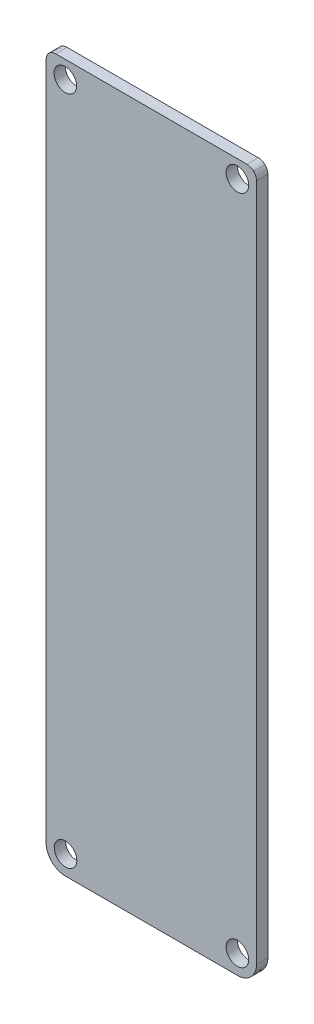
ISO-10303-21;
HEADER;
FILE_DESCRIPTION(('STEP AP214'),'2;1');
FILE_NAME('part.step','',(''),(''),'','','');
FILE_SCHEMA(('AUTOMOTIVE_DESIGN { 1 0 10303 214 1 1 1 1 }'));
ENDSEC;
DATA;
#1=APPLICATION_CONTEXT('core data for automotive mechanical design processes');
#2=APPLICATION_PROTOCOL_DEFINITION('international standard','automotive_design',2000,#1);
#3=PRODUCT_CONTEXT('',#1,'mechanical');
#4=PRODUCT('Part','Part','',(#3));
#5=PRODUCT_RELATED_PRODUCT_CATEGORY('part','',(#4));
#6=PRODUCT_DEFINITION_FORMATION('','',#4);
#7=PRODUCT_DEFINITION_CONTEXT('part definition',#1,'design');
#8=PRODUCT_DEFINITION('design','',#6,#7);
#9=PRODUCT_DEFINITION_SHAPE('','',#8);
#10=(LENGTH_UNIT() NAMED_UNIT(*) SI_UNIT(.MILLI.,.METRE.));
#11=(NAMED_UNIT(*) PLANE_ANGLE_UNIT() SI_UNIT($,.RADIAN.));
#12=(NAMED_UNIT(*) SI_UNIT($,.STERADIAN.) SOLID_ANGLE_UNIT());
#13=UNCERTAINTY_MEASURE_WITH_UNIT(LENGTH_MEASURE(1.E-05),#10,'distance_accuracy_value','');
#14=(GEOMETRIC_REPRESENTATION_CONTEXT(3) GLOBAL_UNCERTAINTY_ASSIGNED_CONTEXT((#13)) GLOBAL_UNIT_ASSIGNED_CONTEXT((#10,
#11,#12)) REPRESENTATION_CONTEXT('',''));
#15=CARTESIAN_POINT('',(0.,0.,0.));
#16=DIRECTION('',(0.,0.,1.));
#17=DIRECTION('',(1.,0.,0.));
#18=AXIS2_PLACEMENT_3D('',#15,#16,#17);
#19=CARTESIAN_POINT('',(110.49,-33.623931,1.5));
#20=CARTESIAN_POINT('',(110.49,-33.287106,1.5));
#21=CARTESIAN_POINT('',(110.356197,-32.964076,1.5));
#22=CARTESIAN_POINT('',(110.118026,-32.725905,1.5));
#23=B_SPLINE_CURVE_WITH_KNOTS('',3,(#19,#20,#21,#22),.UNSPECIFIED.,.F.,.F.,(4,4),(0.,1.),.UNSPECIFIED.);
#24=DIRECTION('',(0.,0.,-1.));
#25=VECTOR('',#24,1.);
#26=SURFACE_OF_LINEAR_EXTRUSION('',#23,#25);
#27=CARTESIAN_POINT('',(110.49,-33.623931,0.));
#28=CARTESIAN_POINT('',(110.49,-33.287106,0.));
#29=CARTESIAN_POINT('',(110.356197,-32.964076,0.));
#30=CARTESIAN_POINT('',(110.118026,-32.725905,0.));
#31=B_SPLINE_CURVE_WITH_KNOTS('',3,(#27,#28,#29,#30),.UNSPECIFIED.,.F.,.F.,(4,4),(0.,1.),.UNSPECIFIED.);
#32=CARTESIAN_POINT('',(110.49,-33.623931,0.));
#33=VERTEX_POINT('',#32);
#34=CARTESIAN_POINT('',(110.118026,-32.725905,0.));
#35=VERTEX_POINT('',#34);
#36=EDGE_CURVE('E293',#33,#35,#31,.T.);
#37=ORIENTED_EDGE('',*,*,#36,.T.);
#38=DIRECTION('',(0.,0.,-1.));
#39=VECTOR('',#38,1.);
#40=CARTESIAN_POINT('',(110.118026,-32.725905,1.5));
#41=LINE('',#40,#39);
#42=CARTESIAN_POINT('',(110.118026,-32.725905,1.5));
#43=VERTEX_POINT('',#42);
#44=EDGE_CURVE('E11',#43,#35,#41,.T.);
#45=ORIENTED_EDGE('',*,*,#44,.F.);
#46=CARTESIAN_POINT('',(110.49,-33.623931,1.5));
#47=VERTEX_POINT('',#46);
#48=EDGE_CURVE('E233',#47,#43,#23,.T.);
#49=ORIENTED_EDGE('',*,*,#48,.F.);
#50=DIRECTION('',(0.,0.,-1.));
#51=VECTOR('',#50,1.);
#52=CARTESIAN_POINT('',(110.49,-33.623931,1.5));
#53=LINE('',#52,#51);
#54=EDGE_CURVE('E150',#47,#33,#53,.T.);
#55=ORIENTED_EDGE('',*,*,#54,.T.);
#56=EDGE_LOOP('',(#37,#45,#49,#55));
#57=FACE_BOUND('',#56,.T.);
#58=ADVANCED_FACE('F32',(#57),#26,.F.);
#59=CARTESIAN_POINT('',(110.118026,-32.725905,1.5));
#60=CARTESIAN_POINT('',(109.879854,-32.487734,1.5));
#61=CARTESIAN_POINT('',(109.556825,-32.353931,1.5));
#62=CARTESIAN_POINT('',(109.22,-32.353931,1.5));
#63=B_SPLINE_CURVE_WITH_KNOTS('',3,(#59,#60,#61,#62),.UNSPECIFIED.,.F.,.F.,(4,4),(0.,1.),.UNSPECIFIED.);
#64=DIRECTION('',(0.,0.,-1.));
#65=VECTOR('',#64,1.);
#66=SURFACE_OF_LINEAR_EXTRUSION('',#63,#65);
#67=CARTESIAN_POINT('',(110.118026,-32.725905,0.));
#68=CARTESIAN_POINT('',(109.879854,-32.487734,0.));
#69=CARTESIAN_POINT('',(109.556825,-32.353931,0.));
#70=CARTESIAN_POINT('',(109.22,-32.353931,0.));
#71=B_SPLINE_CURVE_WITH_KNOTS('',3,(#67,#68,#69,#70),.UNSPECIFIED.,.F.,.F.,(4,4),(0.,1.),.UNSPECIFIED.);
#72=CARTESIAN_POINT('',(109.22,-32.353931,0.));
#73=VERTEX_POINT('',#72);
#74=EDGE_CURVE('E290',#35,#73,#71,.T.);
#75=ORIENTED_EDGE('',*,*,#74,.T.);
#76=DIRECTION('',(0.,0.,-1.));
#77=VECTOR('',#76,1.);
#78=CARTESIAN_POINT('',(109.22,-32.353931,1.5));
#79=LINE('',#78,#77);
#80=CARTESIAN_POINT('',(109.22,-32.353931,1.5));
#81=VERTEX_POINT('',#80);
#82=EDGE_CURVE('E41',#81,#73,#79,.T.);
#83=ORIENTED_EDGE('',*,*,#82,.F.);
#84=EDGE_CURVE('E102',#43,#81,#63,.T.);
#85=ORIENTED_EDGE('',*,*,#84,.F.);
#86=ORIENTED_EDGE('',*,*,#44,.T.);
#87=EDGE_LOOP('',(#75,#83,#85,#86));
#88=FACE_BOUND('',#87,.T.);
#89=ADVANCED_FACE('F225',(#88),#66,.F.);
#90=CARTESIAN_POINT('',(83.82,-32.353931,1.5));
#91=DIRECTION('',(0.,-1.,0.));
#92=DIRECTION('',(0.,0.,-1.));
#93=AXIS2_PLACEMENT_3D('',#90,#91,#92);
#94=PLANE('',#93);
#95=DIRECTION('',(-1.,0.,0.));
#96=VECTOR('',#95,1.);
#97=CARTESIAN_POINT('',(83.82,-32.353931,0.));
#98=LINE('',#97,#96);
#99=CARTESIAN_POINT('',(83.82,-32.353931,0.));
#100=VERTEX_POINT('',#99);
#101=EDGE_CURVE('E288',#73,#100,#98,.T.);
#102=ORIENTED_EDGE('',*,*,#101,.T.);
#103=DIRECTION('',(0.,0.,-1.));
#104=VECTOR('',#103,1.);
#105=CARTESIAN_POINT('',(83.82,-32.353931,1.5));
#106=LINE('',#105,#104);
#107=CARTESIAN_POINT('',(83.82,-32.353931,1.5));
#108=VERTEX_POINT('',#107);
#109=EDGE_CURVE('E254',#108,#100,#106,.T.);
#110=ORIENTED_EDGE('',*,*,#109,.F.);
#111=DIRECTION('',(-1.,0.,0.));
#112=VECTOR('',#111,1.);
#113=CARTESIAN_POINT('',(83.82,-32.353931,1.5));
#114=LINE('',#113,#112);
#115=EDGE_CURVE('E232',#81,#108,#114,.T.);
#116=ORIENTED_EDGE('',*,*,#115,.F.);
#117=ORIENTED_EDGE('',*,*,#82,.T.);
#118=EDGE_LOOP('',(#102,#110,#116,#117));
#119=FACE_BOUND('',#118,.T.);
#120=ADVANCED_FACE('F222',(#119),#94,.F.);
#121=CARTESIAN_POINT('',(83.82,-32.353931,1.5));
#122=CARTESIAN_POINT('',(83.483175,-32.353931,1.5));
#123=CARTESIAN_POINT('',(83.160146,-32.487734,1.5));
#124=CARTESIAN_POINT('',(82.921974,-32.725905,1.5));
#125=B_SPLINE_CURVE_WITH_KNOTS('',3,(#121,#122,#123,#124),.UNSPECIFIED.,.F.,.F.,(4,4),(0.,1.),.UNSPECIFIED.);
#126=DIRECTION('',(0.,0.,-1.));
#127=VECTOR('',#126,1.);
#128=SURFACE_OF_LINEAR_EXTRUSION('',#125,#127);
#129=CARTESIAN_POINT('',(83.82,-32.353931,0.));
#130=CARTESIAN_POINT('',(83.483175,-32.353931,0.));
#131=CARTESIAN_POINT('',(83.160146,-32.487734,0.));
#132=CARTESIAN_POINT('',(82.921974,-32.725905,0.));
#133=B_SPLINE_CURVE_WITH_KNOTS('',3,(#129,#130,#131,#132),.UNSPECIFIED.,.F.,.F.,(4,4),(0.,1.),.UNSPECIFIED.);
#134=CARTESIAN_POINT('',(82.921974,-32.725905,0.));
#135=VERTEX_POINT('',#134);
#136=EDGE_CURVE('E251',#100,#135,#133,.T.);
#137=ORIENTED_EDGE('',*,*,#136,.T.);
#138=DIRECTION('',(0.,0.,-1.));
#139=VECTOR('',#138,1.);
#140=CARTESIAN_POINT('',(82.921974,-32.725905,1.5));
#141=LINE('',#140,#139);
#142=CARTESIAN_POINT('',(82.921974,-32.725905,1.5));
#143=VERTEX_POINT('',#142);
#144=EDGE_CURVE('E249',#143,#135,#141,.T.);
#145=ORIENTED_EDGE('',*,*,#144,.F.);
#146=EDGE_CURVE('E205',#108,#143,#125,.T.);
#147=ORIENTED_EDGE('',*,*,#146,.F.);
#148=ORIENTED_EDGE('',*,*,#109,.T.);
#149=EDGE_LOOP('',(#137,#145,#147,#148));
#150=FACE_BOUND('',#149,.T.);
#151=ADVANCED_FACE('F218',(#150),#128,.F.);
#152=CARTESIAN_POINT('',(82.921974,-32.725905,1.5));
#153=CARTESIAN_POINT('',(82.683803,-32.964076,1.5));
#154=CARTESIAN_POINT('',(82.55,-33.287106,1.5));
#155=CARTESIAN_POINT('',(82.55,-33.623931,1.5));
#156=B_SPLINE_CURVE_WITH_KNOTS('',3,(#152,#153,#154,#155),.UNSPECIFIED.,.F.,.F.,(4,4),(0.,1.),.UNSPECIFIED.);
#157=DIRECTION('',(0.,0.,-1.));
#158=VECTOR('',#157,1.);
#159=SURFACE_OF_LINEAR_EXTRUSION('',#156,#158);
#160=CARTESIAN_POINT('',(82.921974,-32.725905,0.));
#161=CARTESIAN_POINT('',(82.683803,-32.964076,0.));
#162=CARTESIAN_POINT('',(82.55,-33.287106,0.));
#163=CARTESIAN_POINT('',(82.55,-33.623931,0.));
#164=B_SPLINE_CURVE_WITH_KNOTS('',3,(#160,#161,#162,#163),.UNSPECIFIED.,.F.,.F.,(4,4),(0.,1.),.UNSPECIFIED.);
#165=CARTESIAN_POINT('',(82.55,-33.623931,0.));
#166=VERTEX_POINT('',#165);
#167=EDGE_CURVE('E259',#135,#166,#164,.T.);
#168=ORIENTED_EDGE('',*,*,#167,.T.);
#169=DIRECTION('',(0.,0.,-1.));
#170=VECTOR('',#169,1.);
#171=CARTESIAN_POINT('',(82.55,-33.623931,1.5));
#172=LINE('',#171,#170);
#173=CARTESIAN_POINT('',(82.55,-33.623931,1.5));
#174=VERTEX_POINT('',#173);
#175=EDGE_CURVE('E255',#174,#166,#172,.T.);
#176=ORIENTED_EDGE('',*,*,#175,.F.);
#177=EDGE_CURVE('E200',#143,#174,#156,.T.);
#178=ORIENTED_EDGE('',*,*,#177,.F.);
#179=ORIENTED_EDGE('',*,*,#144,.T.);
#180=EDGE_LOOP('',(#168,#176,#178,#179));
#181=FACE_BOUND('',#180,.T.);
#182=ADVANCED_FACE('F214',(#181),#159,.F.);
#183=CARTESIAN_POINT('',(82.55,-39.893931,1.5));
#184=DIRECTION('',(1.,0.,0.));
#185=DIRECTION('',(0.,0.,-1.));
#186=AXIS2_PLACEMENT_3D('',#183,#184,#185);
#187=PLANE('',#186);
#188=DIRECTION('',(0.,-1.,0.));
#189=VECTOR('',#188,1.);
#190=CARTESIAN_POINT('',(82.55,-39.893931,0.));
#191=LINE('',#190,#189);
#192=CARTESIAN_POINT('',(82.55,-123.713931,0.));
#193=VERTEX_POINT('',#192);
#194=EDGE_CURVE('E306',#166,#193,#191,.T.);
#195=ORIENTED_EDGE('',*,*,#194,.T.);
#196=DIRECTION('',(0.,0.,-1.));
#197=VECTOR('',#196,1.);
#198=CARTESIAN_POINT('',(82.55,-123.713931,1.5));
#199=LINE('',#198,#197);
#200=CARTESIAN_POINT('',(82.55,-123.713931,1.5));
#201=VERTEX_POINT('',#200);
#202=EDGE_CURVE('E261',#201,#193,#199,.T.);
#203=ORIENTED_EDGE('',*,*,#202,.F.);
#204=DIRECTION('',(0.,-1.,0.));
#205=VECTOR('',#204,1.);
#206=CARTESIAN_POINT('',(82.55,-38.623931,1.5));
#207=LINE('',#206,#205);
#208=EDGE_CURVE('E195',#174,#201,#207,.T.);
#209=ORIENTED_EDGE('',*,*,#208,.F.);
#210=ORIENTED_EDGE('',*,*,#175,.T.);
#211=EDGE_LOOP('',(#195,#203,#209,#210));
#212=FACE_BOUND('',#211,.T.);
#213=ADVANCED_FACE('F217',(#212),#187,.F.);
#214=CARTESIAN_POINT('',(82.55,-123.713931,1.5));
#215=CARTESIAN_POINT('',(82.55,-124.387581,1.5));
#216=CARTESIAN_POINT('',(82.817606,-125.03364,1.5));
#217=CARTESIAN_POINT('',(83.293949,-125.509982,1.5));
#218=B_SPLINE_CURVE_WITH_KNOTS('',3,(#214,#215,#216,#217),.UNSPECIFIED.,.F.,.F.,(4,4),(0.,1.),.UNSPECIFIED.);
#219=DIRECTION('',(0.,0.,-1.));
#220=VECTOR('',#219,1.);
#221=SURFACE_OF_LINEAR_EXTRUSION('',#218,#220);
#222=CARTESIAN_POINT('',(82.55,-123.713931,0.));
#223=CARTESIAN_POINT('',(82.55,-124.387581,0.));
#224=CARTESIAN_POINT('',(82.817606,-125.03364,0.));
#225=CARTESIAN_POINT('',(83.293949,-125.509982,0.));
#226=B_SPLINE_CURVE_WITH_KNOTS('',3,(#222,#223,#224,#225),.UNSPECIFIED.,.F.,.F.,(4,4),(0.,1.),.UNSPECIFIED.);
#227=CARTESIAN_POINT('',(83.293949,-125.509982,0.));
#228=VERTEX_POINT('',#227);
#229=EDGE_CURVE('E273',#193,#228,#226,.T.);
#230=ORIENTED_EDGE('',*,*,#229,.T.);
#231=DIRECTION('',(0.,0.,-1.));
#232=VECTOR('',#231,1.);
#233=CARTESIAN_POINT('',(83.293949,-125.509982,1.5));
#234=LINE('',#233,#232);
#235=CARTESIAN_POINT('',(83.293949,-125.509982,1.5));
#236=VERTEX_POINT('',#235);
#237=EDGE_CURVE('E271',#236,#228,#234,.T.);
#238=ORIENTED_EDGE('',*,*,#237,.F.);
#239=EDGE_CURVE('E187',#201,#236,#218,.T.);
#240=ORIENTED_EDGE('',*,*,#239,.F.);
#241=ORIENTED_EDGE('',*,*,#202,.T.);
#242=EDGE_LOOP('',(#230,#238,#240,#241));
#243=FACE_BOUND('',#242,.T.);
#244=ADVANCED_FACE('F179',(#243),#221,.F.);
#245=CARTESIAN_POINT('',(83.293949,-125.509982,1.5));
#246=CARTESIAN_POINT('',(83.770291,-125.986325,1.5));
#247=CARTESIAN_POINT('',(84.41635,-126.253931,1.5));
#248=CARTESIAN_POINT('',(85.09,-126.253931,1.5));
#249=B_SPLINE_CURVE_WITH_KNOTS('',3,(#245,#246,#247,#248),.UNSPECIFIED.,.F.,.F.,(4,4),(0.,1.),.UNSPECIFIED.);
#250=DIRECTION('',(0.,0.,-1.));
#251=VECTOR('',#250,1.);
#252=SURFACE_OF_LINEAR_EXTRUSION('',#249,#251);
#253=CARTESIAN_POINT('',(83.293949,-125.509982,0.));
#254=CARTESIAN_POINT('',(83.770291,-125.986325,0.));
#255=CARTESIAN_POINT('',(84.41635,-126.253931,0.));
#256=CARTESIAN_POINT('',(85.09,-126.253931,0.));
#257=B_SPLINE_CURVE_WITH_KNOTS('',3,(#253,#254,#255,#256),.UNSPECIFIED.,.F.,.F.,(4,4),(0.,1.),.UNSPECIFIED.);
#258=CARTESIAN_POINT('',(85.09,-126.253931,0.));
#259=VERTEX_POINT('',#258);
#260=EDGE_CURVE('E278',#228,#259,#257,.T.);
#261=ORIENTED_EDGE('',*,*,#260,.T.);
#262=DIRECTION('',(0.,0.,-1.));
#263=VECTOR('',#262,1.);
#264=CARTESIAN_POINT('',(85.09,-126.253931,1.5));
#265=LINE('',#264,#263);
#266=CARTESIAN_POINT('',(85.09,-126.253931,1.5));
#267=VERTEX_POINT('',#266);
#268=EDGE_CURVE('E275',#267,#259,#265,.T.);
#269=ORIENTED_EDGE('',*,*,#268,.F.);
#270=EDGE_CURVE('E183',#236,#267,#249,.T.);
#271=ORIENTED_EDGE('',*,*,#270,.F.);
#272=ORIENTED_EDGE('',*,*,#237,.T.);
#273=EDGE_LOOP('',(#261,#269,#271,#272));
#274=FACE_BOUND('',#273,.T.);
#275=ADVANCED_FACE('F174',(#274),#252,.F.);
#276=CARTESIAN_POINT('',(85.09,-126.253931,1.5));
#277=DIRECTION('',(0.,1.,0.));
#278=DIRECTION('',(0.,0.,1.));
#279=AXIS2_PLACEMENT_3D('',#276,#277,#278);
#280=PLANE('',#279);
#281=DIRECTION('',(1.,0.,0.));
#282=VECTOR('',#281,1.);
#283=CARTESIAN_POINT('',(85.09,-126.253931,0.));
#284=LINE('',#283,#282);
#285=CARTESIAN_POINT('',(107.95,-126.253931,0.));
#286=VERTEX_POINT('',#285);
#287=EDGE_CURVE('E281',#259,#286,#284,.T.);
#288=ORIENTED_EDGE('',*,*,#287,.T.);
#289=DIRECTION('',(0.,0.,-1.));
#290=VECTOR('',#289,1.);
#291=CARTESIAN_POINT('',(107.95,-126.253931,1.5));
#292=LINE('',#291,#290);
#293=CARTESIAN_POINT('',(107.95,-126.253931,1.5));
#294=VERTEX_POINT('',#293);
#295=EDGE_CURVE('E145',#294,#286,#292,.T.);
#296=ORIENTED_EDGE('',*,*,#295,.F.);
#297=DIRECTION('',(1.,0.,0.));
#298=VECTOR('',#297,1.);
#299=CARTESIAN_POINT('',(85.09,-126.253931,1.5));
#300=LINE('',#299,#298);
#301=EDGE_CURVE('E134',#267,#294,#300,.T.);
#302=ORIENTED_EDGE('',*,*,#301,.F.);
#303=ORIENTED_EDGE('',*,*,#268,.T.);
#304=EDGE_LOOP('',(#288,#296,#302,#303));
#305=FACE_BOUND('',#304,.T.);
#306=ADVANCED_FACE('F171',(#305),#280,.F.);
#307=CARTESIAN_POINT('',(107.95,-126.253931,1.5));
#308=CARTESIAN_POINT('',(108.62365,-126.253931,1.5));
#309=CARTESIAN_POINT('',(109.269709,-125.986325,1.5));
#310=CARTESIAN_POINT('',(109.746051,-125.509982,1.5));
#311=B_SPLINE_CURVE_WITH_KNOTS('',3,(#307,#308,#309,#310),.UNSPECIFIED.,.F.,.F.,(4,4),(0.,1.),.UNSPECIFIED.);
#312=DIRECTION('',(0.,0.,-1.));
#313=VECTOR('',#312,1.);
#314=SURFACE_OF_LINEAR_EXTRUSION('',#311,#313);
#315=CARTESIAN_POINT('',(107.95,-126.253931,0.));
#316=CARTESIAN_POINT('',(108.62365,-126.253931,0.));
#317=CARTESIAN_POINT('',(109.269709,-125.986325,0.));
#318=CARTESIAN_POINT('',(109.746051,-125.509982,0.));
#319=B_SPLINE_CURVE_WITH_KNOTS('',3,(#315,#316,#317,#318),.UNSPECIFIED.,.F.,.F.,(4,4),(0.,1.),.UNSPECIFIED.);
#320=CARTESIAN_POINT('',(109.746051,-125.509982,0.));
#321=VERTEX_POINT('',#320);
#322=EDGE_CURVE('E143',#286,#321,#319,.T.);
#323=ORIENTED_EDGE('',*,*,#322,.T.);
#324=DIRECTION('',(0.,0.,-1.));
#325=VECTOR('',#324,1.);
#326=CARTESIAN_POINT('',(109.746051,-125.509982,1.5));
#327=LINE('',#326,#325);
#328=CARTESIAN_POINT('',(109.746051,-125.509982,1.5));
#329=VERTEX_POINT('',#328);
#330=EDGE_CURVE('E140',#329,#321,#327,.T.);
#331=ORIENTED_EDGE('',*,*,#330,.F.);
#332=EDGE_CURVE('E127',#294,#329,#311,.T.);
#333=ORIENTED_EDGE('',*,*,#332,.F.);
#334=ORIENTED_EDGE('',*,*,#295,.T.);
#335=EDGE_LOOP('',(#323,#331,#333,#334));
#336=FACE_BOUND('',#335,.T.);
#337=ADVANCED_FACE('F141',(#336),#314,.F.);
#338=CARTESIAN_POINT('',(109.746051,-125.509982,1.5));
#339=CARTESIAN_POINT('',(110.222394,-125.03364,1.5));
#340=CARTESIAN_POINT('',(110.49,-124.387581,1.5));
#341=CARTESIAN_POINT('',(110.49,-123.713931,1.5));
#342=B_SPLINE_CURVE_WITH_KNOTS('',3,(#338,#339,#340,#341),.UNSPECIFIED.,.F.,.F.,(4,4),(0.,1.),.UNSPECIFIED.);
#343=DIRECTION('',(0.,0.,-1.));
#344=VECTOR('',#343,1.);
#345=SURFACE_OF_LINEAR_EXTRUSION('',#342,#344);
#346=CARTESIAN_POINT('',(109.746051,-125.509982,0.));
#347=CARTESIAN_POINT('',(110.222394,-125.03364,0.));
#348=CARTESIAN_POINT('',(110.49,-124.387581,0.));
#349=CARTESIAN_POINT('',(110.49,-123.713931,0.));
#350=B_SPLINE_CURVE_WITH_KNOTS('',3,(#346,#347,#348,#349),.UNSPECIFIED.,.F.,.F.,(4,4),(0.,1.),.UNSPECIFIED.);
#351=CARTESIAN_POINT('',(110.49,-123.713931,0.));
#352=VERTEX_POINT('',#351);
#353=EDGE_CURVE('E327',#321,#352,#350,.T.);
#354=ORIENTED_EDGE('',*,*,#353,.T.);
#355=DIRECTION('',(0.,0.,-1.));
#356=VECTOR('',#355,1.);
#357=CARTESIAN_POINT('',(110.49,-123.713931,1.5));
#358=LINE('',#357,#356);
#359=CARTESIAN_POINT('',(110.49,-123.713931,1.5));
#360=VERTEX_POINT('',#359);
#361=EDGE_CURVE('E146',#360,#352,#358,.T.);
#362=ORIENTED_EDGE('',*,*,#361,.F.);
#363=EDGE_CURVE('E131',#329,#360,#342,.T.);
#364=ORIENTED_EDGE('',*,*,#363,.F.);
#365=ORIENTED_EDGE('',*,*,#330,.T.);
#366=EDGE_LOOP('',(#354,#362,#364,#365));
#367=FACE_BOUND('',#366,.T.);
#368=ADVANCED_FACE('F148',(#367),#345,.F.);
#369=CARTESIAN_POINT('',(110.49,-33.623931,1.5));
#370=DIRECTION('',(-1.,0.,0.));
#371=DIRECTION('',(0.,0.,1.));
#372=AXIS2_PLACEMENT_3D('',#369,#370,#371);
#373=PLANE('',#372);
#374=DIRECTION('',(0.,1.,0.));
#375=VECTOR('',#374,1.);
#376=CARTESIAN_POINT('',(110.49,-33.623931,0.));
#377=LINE('',#376,#375);
#378=EDGE_CURVE('E90',#352,#33,#377,.T.);
#379=ORIENTED_EDGE('',*,*,#378,.T.);
#380=ORIENTED_EDGE('',*,*,#54,.F.);
#381=DIRECTION('',(0.,1.,0.));
#382=VECTOR('',#381,1.);
#383=CARTESIAN_POINT('',(110.49,-39.893931,1.5));
#384=LINE('',#383,#382);
#385=EDGE_CURVE('E49',#360,#47,#384,.T.);
#386=ORIENTED_EDGE('',*,*,#385,.F.);
#387=ORIENTED_EDGE('',*,*,#361,.T.);
#388=EDGE_LOOP('',(#379,#380,#386,#387));
#389=FACE_BOUND('',#388,.T.);
#390=ADVANCED_FACE('F167',(#389),#373,.F.);
#391=CARTESIAN_POINT('',(110.393327125,-33.13792275,1.5));
#392=DIRECTION('',(0.,0.,-1.));
#393=DIRECTION('',(-1.,0.,0.));
#394=AXIS2_PLACEMENT_3D('',#391,#392,#393);
#395=PLANE('',#394);
#396=CARTESIAN_POINT('',(107.943434753132,-123.713931,1.5));
#397=DIRECTION('',(0.,0.,-1.));
#398=DIRECTION('',(-1.,0.,0.));
#399=AXIS2_PLACEMENT_3D('',#396,#397,#398);
#400=CIRCLE('',#399,1.5);
#401=CARTESIAN_POINT('',(106.443434753132,-123.713931,1.5));
#402=VERTEX_POINT('',#401);
#403=EDGE_CURVE('E342',#402,#402,#400,.T.);
#404=ORIENTED_EDGE('',*,*,#403,.T.);
#405=EDGE_LOOP('',(#404));
#406=FACE_BOUND('',#405,.T.);
#407=CARTESIAN_POINT('',(85.1247717146963,-123.713931,1.5));
#408=DIRECTION('',(0.,0.,-1.));
#409=DIRECTION('',(-1.,0.,0.));
#410=AXIS2_PLACEMENT_3D('',#407,#408,#409);
#411=CIRCLE('',#410,1.5);
#412=CARTESIAN_POINT('',(83.6247717146963,-123.713931,1.5));
#413=VERTEX_POINT('',#412);
#414=EDGE_CURVE('E344',#413,#413,#411,.T.);
#415=ORIENTED_EDGE('',*,*,#414,.T.);
#416=EDGE_LOOP('',(#415));
#417=FACE_BOUND('',#416,.T.);
#418=CARTESIAN_POINT('',(85.0965652468675,-34.6757095580392,1.5));
#419=DIRECTION('',(0.,0.,-1.));
#420=DIRECTION('',(-1.,0.,0.));
#421=AXIS2_PLACEMENT_3D('',#418,#419,#420);
#422=CIRCLE('',#421,1.5);
#423=CARTESIAN_POINT('',(83.5965652468675,-34.6757095580392,1.5));
#424=VERTEX_POINT('',#423);
#425=EDGE_CURVE('E353',#424,#424,#422,.T.);
#426=ORIENTED_EDGE('',*,*,#425,.T.);
#427=EDGE_LOOP('',(#426));
#428=FACE_BOUND('',#427,.T.);
#429=CARTESIAN_POINT('',(107.943434753132,-34.6757095580392,1.5));
#430=DIRECTION('',(0.,0.,-1.));
#431=DIRECTION('',(-1.,0.,0.));
#432=AXIS2_PLACEMENT_3D('',#429,#430,#431);
#433=CIRCLE('',#432,1.5);
#434=CARTESIAN_POINT('',(106.443434753132,-34.6757095580392,1.5));
#435=VERTEX_POINT('',#434);
#436=EDGE_CURVE('E358',#435,#435,#433,.T.);
#437=ORIENTED_EDGE('',*,*,#436,.T.);
#438=EDGE_LOOP('',(#437));
#439=FACE_BOUND('',#438,.T.);
#440=ORIENTED_EDGE('',*,*,#48,.T.);
#441=ORIENTED_EDGE('',*,*,#84,.T.);
#442=ORIENTED_EDGE('',*,*,#115,.T.);
#443=ORIENTED_EDGE('',*,*,#146,.T.);
#444=ORIENTED_EDGE('',*,*,#177,.T.);
#445=ORIENTED_EDGE('',*,*,#208,.T.);
#446=ORIENTED_EDGE('',*,*,#239,.T.);
#447=ORIENTED_EDGE('',*,*,#270,.T.);
#448=ORIENTED_EDGE('',*,*,#301,.T.);
#449=ORIENTED_EDGE('',*,*,#332,.T.);
#450=ORIENTED_EDGE('',*,*,#363,.T.);
#451=ORIENTED_EDGE('',*,*,#385,.T.);
#452=EDGE_LOOP('',(#440,#441,#442,#443,#444,#445,#446,#447,#448,#449,#450,#451));
#453=FACE_BOUND('',#452,.T.);
#454=ADVANCED_FACE('F129',(#406,#417,#428,#439,#453),#395,.F.);
#455=CARTESIAN_POINT('',(110.393327125,-33.13792275,0.));
#456=DIRECTION('',(0.,0.,-1.));
#457=DIRECTION('',(-1.,0.,0.));
#458=AXIS2_PLACEMENT_3D('',#455,#456,#457);
#459=PLANE('',#458);
#460=CARTESIAN_POINT('',(107.943434753132,-123.713931,0.));
#461=DIRECTION('',(0.,0.,-1.));
#462=DIRECTION('',(-1.,0.,0.));
#463=AXIS2_PLACEMENT_3D('',#460,#461,#462);
#464=CIRCLE('',#463,1.5);
#465=CARTESIAN_POINT('',(106.443434753132,-123.713931,0.));
#466=VERTEX_POINT('',#465);
#467=EDGE_CURVE('E365',#466,#466,#464,.T.);
#468=ORIENTED_EDGE('',*,*,#467,.F.);
#469=EDGE_LOOP('',(#468));
#470=FACE_BOUND('',#469,.T.);
#471=CARTESIAN_POINT('',(85.1247717146963,-123.713931,0.));
#472=DIRECTION('',(0.,0.,-1.));
#473=DIRECTION('',(-1.,0.,0.));
#474=AXIS2_PLACEMENT_3D('',#471,#472,#473);
#475=CIRCLE('',#474,1.5);
#476=CARTESIAN_POINT('',(83.6247717146963,-123.713931,0.));
#477=VERTEX_POINT('',#476);
#478=EDGE_CURVE('E368',#477,#477,#475,.T.);
#479=ORIENTED_EDGE('',*,*,#478,.F.);
#480=EDGE_LOOP('',(#479));
#481=FACE_BOUND('',#480,.T.);
#482=CARTESIAN_POINT('',(85.0965652468675,-34.6757095580392,0.));
#483=DIRECTION('',(0.,0.,-1.));
#484=DIRECTION('',(-1.,0.,0.));
#485=AXIS2_PLACEMENT_3D('',#482,#483,#484);
#486=CIRCLE('',#485,1.5);
#487=CARTESIAN_POINT('',(83.5965652468675,-34.6757095580392,0.));
#488=VERTEX_POINT('',#487);
#489=EDGE_CURVE('E364',#488,#488,#486,.T.);
#490=ORIENTED_EDGE('',*,*,#489,.F.);
#491=EDGE_LOOP('',(#490));
#492=FACE_BOUND('',#491,.T.);
#493=CARTESIAN_POINT('',(107.943434753132,-34.6757095580392,0.));
#494=DIRECTION('',(0.,0.,-1.));
#495=DIRECTION('',(-1.,0.,0.));
#496=AXIS2_PLACEMENT_3D('',#493,#494,#495);
#497=CIRCLE('',#496,1.5);
#498=CARTESIAN_POINT('',(106.443434753132,-34.6757095580392,0.));
#499=VERTEX_POINT('',#498);
#500=EDGE_CURVE('E361',#499,#499,#497,.T.);
#501=ORIENTED_EDGE('',*,*,#500,.F.);
#502=EDGE_LOOP('',(#501));
#503=FACE_BOUND('',#502,.T.);
#504=ORIENTED_EDGE('',*,*,#36,.F.);
#505=ORIENTED_EDGE('',*,*,#378,.F.);
#506=ORIENTED_EDGE('',*,*,#353,.F.);
#507=ORIENTED_EDGE('',*,*,#322,.F.);
#508=ORIENTED_EDGE('',*,*,#287,.F.);
#509=ORIENTED_EDGE('',*,*,#260,.F.);
#510=ORIENTED_EDGE('',*,*,#229,.F.);
#511=ORIENTED_EDGE('',*,*,#194,.F.);
#512=ORIENTED_EDGE('',*,*,#167,.F.);
#513=ORIENTED_EDGE('',*,*,#136,.F.);
#514=ORIENTED_EDGE('',*,*,#101,.F.);
#515=ORIENTED_EDGE('',*,*,#74,.F.);
#516=EDGE_LOOP('',(#504,#505,#506,#507,#508,#509,#510,#511,#512,#513,#514,#515));
#517=FACE_BOUND('',#516,.T.);
#518=ADVANCED_FACE('F289',(#470,#481,#492,#503,#517),#459,.T.);
#519=CARTESIAN_POINT('',(107.943434753132,-34.6757095580392,10.));
#520=DIRECTION('',(0.,0.,-1.));
#521=DIRECTION('',(-1.,0.,0.));
#522=AXIS2_PLACEMENT_3D('',#519,#520,#521);
#523=CYLINDRICAL_SURFACE('',#522,1.5);
#524=ORIENTED_EDGE('',*,*,#500,.T.);
#525=EDGE_LOOP('',(#524));
#526=FACE_BOUND('',#525,.T.);
#527=ORIENTED_EDGE('',*,*,#436,.F.);
#528=EDGE_LOOP('',(#527));
#529=FACE_BOUND('',#528,.T.);
#530=ADVANCED_FACE('F379',(#526,#529),#523,.F.);
#531=CARTESIAN_POINT('',(85.0965652468675,-34.6757095580392,10.));
#532=DIRECTION('',(0.,0.,-1.));
#533=DIRECTION('',(-1.,0.,0.));
#534=AXIS2_PLACEMENT_3D('',#531,#532,#533);
#535=CYLINDRICAL_SURFACE('',#534,1.5);
#536=ORIENTED_EDGE('',*,*,#489,.T.);
#537=EDGE_LOOP('',(#536));
#538=FACE_BOUND('',#537,.T.);
#539=ORIENTED_EDGE('',*,*,#425,.F.);
#540=EDGE_LOOP('',(#539));
#541=FACE_BOUND('',#540,.T.);
#542=ADVANCED_FACE('F374',(#538,#541),#535,.F.);
#543=CARTESIAN_POINT('',(85.1247717146963,-123.713931,10.));
#544=DIRECTION('',(0.,0.,-1.));
#545=DIRECTION('',(-1.,0.,0.));
#546=AXIS2_PLACEMENT_3D('',#543,#544,#545);
#547=CYLINDRICAL_SURFACE('',#546,1.5);
#548=ORIENTED_EDGE('',*,*,#478,.T.);
#549=EDGE_LOOP('',(#548));
#550=FACE_BOUND('',#549,.T.);
#551=ORIENTED_EDGE('',*,*,#414,.F.);
#552=EDGE_LOOP('',(#551));
#553=FACE_BOUND('',#552,.T.);
#554=ADVANCED_FACE('F469',(#550,#553),#547,.F.);
#555=CARTESIAN_POINT('',(107.943434753132,-123.713931,10.));
#556=DIRECTION('',(0.,0.,-1.));
#557=DIRECTION('',(-1.,0.,0.));
#558=AXIS2_PLACEMENT_3D('',#555,#556,#557);
#559=CYLINDRICAL_SURFACE('',#558,1.5);
#560=ORIENTED_EDGE('',*,*,#467,.T.);
#561=EDGE_LOOP('',(#560));
#562=FACE_BOUND('',#561,.T.);
#563=ORIENTED_EDGE('',*,*,#403,.F.);
#564=EDGE_LOOP('',(#563));
#565=FACE_BOUND('',#564,.T.);
#566=ADVANCED_FACE('F478',(#562,#565),#559,.F.);
#567=CLOSED_SHELL('',(#58,#89,#120,#151,#182,#213,#244,#275,#306,#337,#368,#390,#454,#518,#530,
#542,#554,#566));
#568=MANIFOLD_SOLID_BREP('B2',#567);
#569=ADVANCED_BREP_SHAPE_REPRESENTATION('',(#18,#568),#14);
#570=SHAPE_DEFINITION_REPRESENTATION(#9,#569);
ENDSEC;
END-ISO-10303-21;
